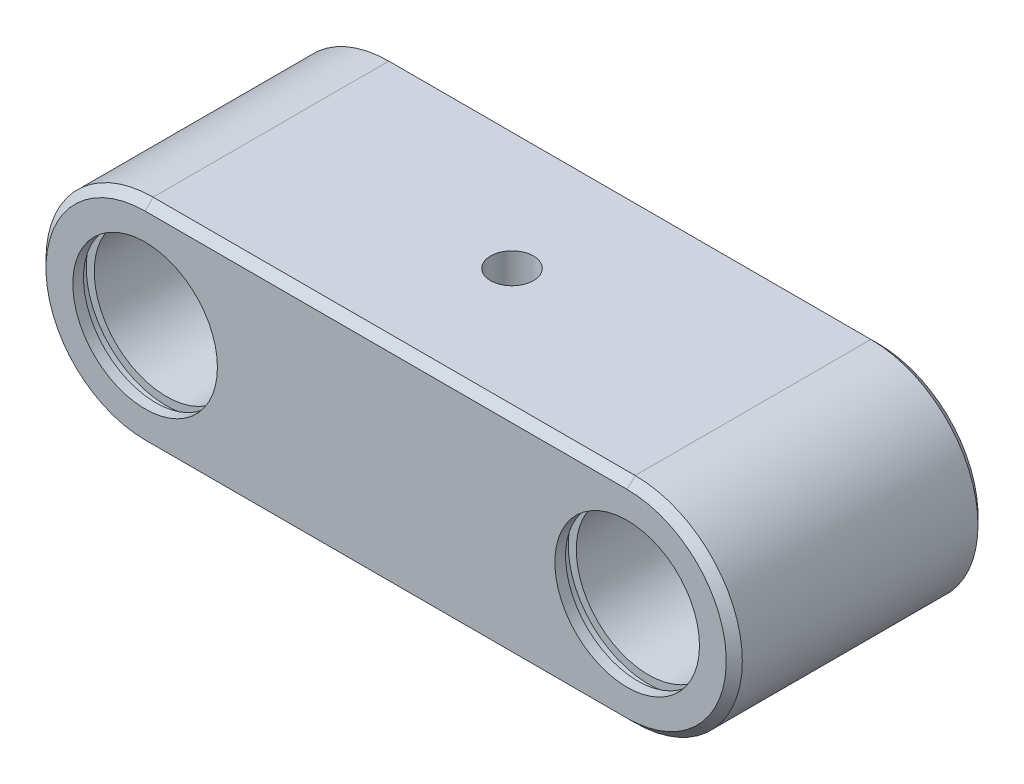
ISO-10303-21;
HEADER;
FILE_DESCRIPTION(('STEP AP214'),'2;1');
FILE_NAME('part.step','',(''),(''),'','','');
FILE_SCHEMA(('AUTOMOTIVE_DESIGN { 1 0 10303 214 1 1 1 1 }'));
ENDSEC;
DATA;
#1=APPLICATION_CONTEXT('core data for automotive mechanical design processes');
#2=APPLICATION_PROTOCOL_DEFINITION('international standard','automotive_design',2000,#1);
#3=PRODUCT_CONTEXT('',#1,'mechanical');
#4=PRODUCT('Part','Part','',(#3));
#5=PRODUCT_RELATED_PRODUCT_CATEGORY('part','',(#4));
#6=PRODUCT_DEFINITION_FORMATION('','',#4);
#7=PRODUCT_DEFINITION_CONTEXT('part definition',#1,'design');
#8=PRODUCT_DEFINITION('design','',#6,#7);
#9=PRODUCT_DEFINITION_SHAPE('','',#8);
#10=(LENGTH_UNIT() NAMED_UNIT(*) SI_UNIT(.MILLI.,.METRE.));
#11=(NAMED_UNIT(*) PLANE_ANGLE_UNIT() SI_UNIT($,.RADIAN.));
#12=(NAMED_UNIT(*) SI_UNIT($,.STERADIAN.) SOLID_ANGLE_UNIT());
#13=UNCERTAINTY_MEASURE_WITH_UNIT(LENGTH_MEASURE(1.E-05),#10,'distance_accuracy_value','');
#14=(GEOMETRIC_REPRESENTATION_CONTEXT(3) GLOBAL_UNCERTAINTY_ASSIGNED_CONTEXT((#13)) GLOBAL_UNIT_ASSIGNED_CONTEXT((#10,
#11,#12)) REPRESENTATION_CONTEXT('',''));
#15=CARTESIAN_POINT('',(0.,0.,0.));
#16=DIRECTION('',(0.,0.,1.));
#17=DIRECTION('',(1.,0.,0.));
#18=AXIS2_PLACEMENT_3D('',#15,#16,#17);
#19=CARTESIAN_POINT('',(-45.,0.,603.));
#20=DIRECTION('',(0.,0.,1.));
#21=DIRECTION('',(1.,0.,0.));
#22=AXIS2_PLACEMENT_3D('',#19,#20,#21);
#23=CYLINDRICAL_SURFACE('',#22,13.5);
#24=CARTESIAN_POINT('',(-45.,0.,646.));
#25=DIRECTION('',(0.,0.,1.));
#26=DIRECTION('',(1.,0.,0.));
#27=AXIS2_PLACEMENT_3D('',#24,#25,#26);
#28=CIRCLE('',#27,13.5);
#29=CARTESIAN_POINT('',(-31.5,0.,646.));
#30=VERTEX_POINT('',#29);
#31=EDGE_CURVE('E238',#30,#30,#28,.T.);
#32=ORIENTED_EDGE('',*,*,#31,.T.);
#33=EDGE_LOOP('',(#32));
#34=FACE_BOUND('',#33,.T.);
#35=CARTESIAN_POINT('',(-45.,0.,607.));
#36=DIRECTION('',(0.,0.,-1.));
#37=DIRECTION('',(-1.,0.,0.));
#38=AXIS2_PLACEMENT_3D('',#35,#36,#37);
#39=CIRCLE('',#38,13.5);
#40=CARTESIAN_POINT('',(-58.4999999999999,0.,607.));
#41=VERTEX_POINT('',#40);
#42=EDGE_CURVE('E255',#41,#41,#39,.T.);
#43=ORIENTED_EDGE('',*,*,#42,.T.);
#44=EDGE_LOOP('',(#43));
#45=FACE_BOUND('',#44,.T.);
#46=ADVANCED_FACE('F45',(#34,#45),#23,.F.);
#47=CARTESIAN_POINT('',(45.,0.,603.));
#48=DIRECTION('',(0.,0.,1.));
#49=DIRECTION('',(1.,0.,0.));
#50=AXIS2_PLACEMENT_3D('',#47,#48,#49);
#51=CYLINDRICAL_SURFACE('',#50,13.5);
#52=CARTESIAN_POINT('',(45.,0.,646.));
#53=DIRECTION('',(0.,0.,1.));
#54=DIRECTION('',(1.,0.,0.));
#55=AXIS2_PLACEMENT_3D('',#52,#53,#54);
#56=CIRCLE('',#55,13.5);
#57=CARTESIAN_POINT('',(58.5,0.,646.));
#58=VERTEX_POINT('',#57);
#59=EDGE_CURVE('E225',#58,#58,#56,.T.);
#60=ORIENTED_EDGE('',*,*,#59,.T.);
#61=EDGE_LOOP('',(#60));
#62=FACE_BOUND('',#61,.T.);
#63=CARTESIAN_POINT('',(45.,0.,607.));
#64=DIRECTION('',(0.,0.,-1.));
#65=DIRECTION('',(-1.,0.,0.));
#66=AXIS2_PLACEMENT_3D('',#63,#64,#65);
#67=CIRCLE('',#66,13.5);
#68=CARTESIAN_POINT('',(31.4999999999999,0.,607.));
#69=VERTEX_POINT('',#68);
#70=EDGE_CURVE('E266',#69,#69,#67,.T.);
#71=ORIENTED_EDGE('',*,*,#70,.T.);
#72=EDGE_LOOP('',(#71));
#73=FACE_BOUND('',#72,.T.);
#74=ADVANCED_FACE('F274',(#62,#73),#51,.F.);
#75=CARTESIAN_POINT('',(-45.,0.,605.));
#76=DIRECTION('',(0.,0.,-1.));
#77=DIRECTION('',(-1.,0.,0.));
#78=AXIS2_PLACEMENT_3D('',#75,#76,#77);
#79=CIRCLE('',#78,13.5);
#80=CARTESIAN_POINT('',(-58.4999999999999,0.,605.));
#81=VERTEX_POINT('',#80);
#82=EDGE_CURVE('E181',#81,#81,#79,.T.);
#83=ORIENTED_EDGE('',*,*,#82,.F.);
#84=EDGE_LOOP('',(#83));
#85=FACE_BOUND('',#84,.T.);
#86=CARTESIAN_POINT('',(-45.,0.,603.));
#87=DIRECTION('',(0.,0.,1.));
#88=DIRECTION('',(1.,0.,0.));
#89=AXIS2_PLACEMENT_3D('',#86,#87,#88);
#90=CIRCLE('',#89,13.5);
#91=CARTESIAN_POINT('',(-31.5,0.,603.));
#92=VERTEX_POINT('',#91);
#93=EDGE_CURVE('E139',#92,#92,#90,.T.);
#94=ORIENTED_EDGE('',*,*,#93,.F.);
#95=EDGE_LOOP('',(#94));
#96=FACE_BOUND('',#95,.T.);
#97=ADVANCED_FACE('F303',(#85,#96),#23,.F.);
#98=CARTESIAN_POINT('',(45.,0.,605.));
#99=DIRECTION('',(0.,0.,-1.));
#100=DIRECTION('',(-1.,0.,0.));
#101=AXIS2_PLACEMENT_3D('',#98,#99,#100);
#102=CIRCLE('',#101,13.5);
#103=CARTESIAN_POINT('',(31.4999999999999,0.,605.));
#104=VERTEX_POINT('',#103);
#105=EDGE_CURVE('E258',#104,#104,#102,.T.);
#106=ORIENTED_EDGE('',*,*,#105,.F.);
#107=EDGE_LOOP('',(#106));
#108=FACE_BOUND('',#107,.T.);
#109=CARTESIAN_POINT('',(45.,0.,603.));
#110=DIRECTION('',(0.,0.,1.));
#111=DIRECTION('',(1.,0.,0.));
#112=AXIS2_PLACEMENT_3D('',#109,#110,#111);
#113=CIRCLE('',#112,13.5);
#114=CARTESIAN_POINT('',(58.5,0.,603.));
#115=VERTEX_POINT('',#114);
#116=EDGE_CURVE('E212',#115,#115,#113,.T.);
#117=ORIENTED_EDGE('',*,*,#116,.F.);
#118=EDGE_LOOP('',(#117));
#119=FACE_BOUND('',#118,.T.);
#120=ADVANCED_FACE('F311',(#108,#119),#51,.F.);
#121=CARTESIAN_POINT('',(-45.,0.,603.));
#122=DIRECTION('',(0.,0.,1.));
#123=DIRECTION('',(1.,0.,0.));
#124=AXIS2_PLACEMENT_3D('',#121,#122,#123);
#125=CYLINDRICAL_SURFACE('',#124,20.);
#126=DIRECTION('',(0.,0.,1.));
#127=VECTOR('',#126,1.);
#128=CARTESIAN_POINT('',(-45.,20.,603.));
#129=LINE('',#128,#127);
#130=CARTESIAN_POINT('',(-45.,20.,604.5));
#131=VERTEX_POINT('',#130);
#132=CARTESIAN_POINT('',(-45.,20.,648.5));
#133=VERTEX_POINT('',#132);
#134=EDGE_CURVE('E121',#131,#133,#129,.T.);
#135=ORIENTED_EDGE('',*,*,#134,.F.);
#136=CARTESIAN_POINT('',(-45.,0.,604.5));
#137=DIRECTION('',(0.,0.,1.));
#138=DIRECTION('',(1.,0.,0.));
#139=AXIS2_PLACEMENT_3D('',#136,#137,#138);
#140=CIRCLE('',#139,20.);
#141=CARTESIAN_POINT('',(-45.,-20.,604.5));
#142=VERTEX_POINT('',#141);
#143=EDGE_CURVE('E116',#131,#142,#140,.T.);
#144=ORIENTED_EDGE('',*,*,#143,.T.);
#145=DIRECTION('',(0.,0.,1.));
#146=VECTOR('',#145,1.);
#147=CARTESIAN_POINT('',(-45.,-20.,603.));
#148=LINE('',#147,#146);
#149=CARTESIAN_POINT('',(-45.,-20.,648.5));
#150=VERTEX_POINT('',#149);
#151=EDGE_CURVE('E119',#142,#150,#148,.T.);
#152=ORIENTED_EDGE('',*,*,#151,.T.);
#153=CARTESIAN_POINT('',(-45.,0.,648.5));
#154=DIRECTION('',(0.,0.,1.));
#155=DIRECTION('',(1.,0.,0.));
#156=AXIS2_PLACEMENT_3D('',#153,#154,#155);
#157=CIRCLE('',#156,20.);
#158=EDGE_CURVE('E127',#150,#133,#157,.F.);
#159=ORIENTED_EDGE('',*,*,#158,.T.);
#160=EDGE_LOOP('',(#135,#144,#152,#159));
#161=FACE_BOUND('',#160,.T.);
#162=ADVANCED_FACE('F118',(#161),#125,.T.);
#163=CARTESIAN_POINT('',(-45.,20.,603.));
#164=DIRECTION('',(0.,1.,0.));
#165=DIRECTION('',(0.,0.,1.));
#166=AXIS2_PLACEMENT_3D('',#163,#164,#165);
#167=PLANE('',#166);
#168=CARTESIAN_POINT('',(0.,20.,626.5));
#169=DIRECTION('',(0.,1.,0.));
#170=DIRECTION('',(0.,0.,1.));
#171=AXIS2_PLACEMENT_3D('',#168,#169,#170);
#172=CIRCLE('',#171,4.);
#173=CARTESIAN_POINT('',(0.,20.,630.5));
#174=VERTEX_POINT('',#173);
#175=EDGE_CURVE('E245',#174,#174,#172,.T.);
#176=ORIENTED_EDGE('',*,*,#175,.F.);
#177=EDGE_LOOP('',(#176));
#178=FACE_BOUND('',#177,.T.);
#179=DIRECTION('',(0.,0.,1.));
#180=VECTOR('',#179,1.);
#181=CARTESIAN_POINT('',(45.,20.,603.));
#182=LINE('',#181,#180);
#183=CARTESIAN_POINT('',(45.,20.,604.5));
#184=VERTEX_POINT('',#183);
#185=CARTESIAN_POINT('',(45.,20.,648.5));
#186=VERTEX_POINT('',#185);
#187=EDGE_CURVE('E201',#184,#186,#182,.T.);
#188=ORIENTED_EDGE('',*,*,#187,.F.);
#189=DIRECTION('',(-1.,0.,0.));
#190=VECTOR('',#189,1.);
#191=CARTESIAN_POINT('',(-45.,20.,604.5));
#192=LINE('',#191,#190);
#193=EDGE_CURVE('E170',#184,#131,#192,.T.);
#194=ORIENTED_EDGE('',*,*,#193,.T.);
#195=ORIENTED_EDGE('',*,*,#134,.T.);
#196=DIRECTION('',(1.,0.,0.));
#197=VECTOR('',#196,1.);
#198=CARTESIAN_POINT('',(-45.,20.,648.5));
#199=LINE('',#198,#197);
#200=EDGE_CURVE('E126',#133,#186,#199,.T.);
#201=ORIENTED_EDGE('',*,*,#200,.T.);
#202=EDGE_LOOP('',(#188,#194,#195,#201));
#203=FACE_BOUND('',#202,.T.);
#204=ADVANCED_FACE('F200',(#178,#203),#167,.T.);
#205=CARTESIAN_POINT('',(45.,0.,603.));
#206=DIRECTION('',(0.,0.,1.));
#207=DIRECTION('',(1.,0.,0.));
#208=AXIS2_PLACEMENT_3D('',#205,#206,#207);
#209=CYLINDRICAL_SURFACE('',#208,20.);
#210=DIRECTION('',(0.,0.,1.));
#211=VECTOR('',#210,1.);
#212=CARTESIAN_POINT('',(45.,-20.,603.));
#213=LINE('',#212,#211);
#214=CARTESIAN_POINT('',(45.,-20.,604.5));
#215=VERTEX_POINT('',#214);
#216=CARTESIAN_POINT('',(45.,-20.,648.5));
#217=VERTEX_POINT('',#216);
#218=EDGE_CURVE('E138',#215,#217,#213,.T.);
#219=ORIENTED_EDGE('',*,*,#218,.F.);
#220=CARTESIAN_POINT('',(45.,0.,604.5));
#221=DIRECTION('',(0.,0.,1.));
#222=DIRECTION('',(1.,0.,0.));
#223=AXIS2_PLACEMENT_3D('',#220,#221,#222);
#224=CIRCLE('',#223,20.);
#225=EDGE_CURVE('E166',#215,#184,#224,.T.);
#226=ORIENTED_EDGE('',*,*,#225,.T.);
#227=ORIENTED_EDGE('',*,*,#187,.T.);
#228=CARTESIAN_POINT('',(45.,0.,648.5));
#229=DIRECTION('',(0.,0.,1.));
#230=DIRECTION('',(1.,0.,0.));
#231=AXIS2_PLACEMENT_3D('',#228,#229,#230);
#232=CIRCLE('',#231,20.);
#233=EDGE_CURVE('E164',#186,#217,#232,.F.);
#234=ORIENTED_EDGE('',*,*,#233,.T.);
#235=EDGE_LOOP('',(#219,#226,#227,#234));
#236=FACE_BOUND('',#235,.T.);
#237=ADVANCED_FACE('F204',(#236),#209,.T.);
#238=CARTESIAN_POINT('',(-45.,-20.,603.));
#239=DIRECTION('',(0.,-1.,0.));
#240=DIRECTION('',(0.,0.,-1.));
#241=AXIS2_PLACEMENT_3D('',#238,#239,#240);
#242=PLANE('',#241);
#243=CARTESIAN_POINT('',(0.,-20.,626.5));
#244=DIRECTION('',(0.,1.,0.));
#245=DIRECTION('',(0.,0.,1.));
#246=AXIS2_PLACEMENT_3D('',#243,#244,#245);
#247=CIRCLE('',#246,4.);
#248=CARTESIAN_POINT('',(0.,-20.,630.5));
#249=VERTEX_POINT('',#248);
#250=EDGE_CURVE('E232',#249,#249,#247,.T.);
#251=ORIENTED_EDGE('',*,*,#250,.T.);
#252=EDGE_LOOP('',(#251));
#253=FACE_BOUND('',#252,.T.);
#254=ORIENTED_EDGE('',*,*,#151,.F.);
#255=DIRECTION('',(1.,0.,0.));
#256=VECTOR('',#255,1.);
#257=CARTESIAN_POINT('',(45.,-20.,604.5));
#258=LINE('',#257,#256);
#259=EDGE_CURVE('E135',#142,#215,#258,.T.);
#260=ORIENTED_EDGE('',*,*,#259,.T.);
#261=ORIENTED_EDGE('',*,*,#218,.T.);
#262=DIRECTION('',(-1.,0.,0.));
#263=VECTOR('',#262,1.);
#264=CARTESIAN_POINT('',(-45.,-20.,648.5));
#265=LINE('',#264,#263);
#266=EDGE_CURVE('E137',#217,#150,#265,.T.);
#267=ORIENTED_EDGE('',*,*,#266,.T.);
#268=EDGE_LOOP('',(#254,#260,#261,#267));
#269=FACE_BOUND('',#268,.T.);
#270=ADVANCED_FACE('F132',(#253,#269),#242,.T.);
#271=CARTESIAN_POINT('',(-45.,0.,603.));
#272=DIRECTION('',(0.,0.,1.));
#273=DIRECTION('',(1.,0.,0.));
#274=AXIS2_PLACEMENT_3D('',#271,#272,#273);
#275=PLANE('',#274);
#276=CARTESIAN_POINT('',(45.,0.,603.));
#277=DIRECTION('',(0.,0.,1.));
#278=DIRECTION('',(1.,0.,0.));
#279=AXIS2_PLACEMENT_3D('',#276,#277,#278);
#280=CIRCLE('',#279,18.5);
#281=CARTESIAN_POINT('',(45.,18.5,603.));
#282=VERTEX_POINT('',#281);
#283=CARTESIAN_POINT('',(45.,-18.5,603.));
#284=VERTEX_POINT('',#283);
#285=EDGE_CURVE('E160',#282,#284,#280,.F.);
#286=ORIENTED_EDGE('',*,*,#285,.T.);
#287=DIRECTION('',(-1.,0.,0.));
#288=VECTOR('',#287,1.);
#289=CARTESIAN_POINT('',(-45.,-18.5,603.));
#290=LINE('',#289,#288);
#291=CARTESIAN_POINT('',(-45.,-18.5,603.));
#292=VERTEX_POINT('',#291);
#293=EDGE_CURVE('E162',#284,#292,#290,.T.);
#294=ORIENTED_EDGE('',*,*,#293,.T.);
#295=CARTESIAN_POINT('',(-45.,0.,603.));
#296=DIRECTION('',(0.,0.,1.));
#297=DIRECTION('',(1.,0.,0.));
#298=AXIS2_PLACEMENT_3D('',#295,#296,#297);
#299=CIRCLE('',#298,18.5);
#300=CARTESIAN_POINT('',(-45.,18.5,603.));
#301=VERTEX_POINT('',#300);
#302=EDGE_CURVE('E144',#292,#301,#299,.F.);
#303=ORIENTED_EDGE('',*,*,#302,.T.);
#304=DIRECTION('',(1.,0.,0.));
#305=VECTOR('',#304,1.);
#306=CARTESIAN_POINT('',(45.,18.5,603.));
#307=LINE('',#306,#305);
#308=EDGE_CURVE('E154',#301,#282,#307,.T.);
#309=ORIENTED_EDGE('',*,*,#308,.T.);
#310=EDGE_LOOP('',(#286,#294,#303,#309));
#311=FACE_BOUND('',#310,.T.);
#312=ORIENTED_EDGE('',*,*,#116,.T.);
#313=EDGE_LOOP('',(#312));
#314=FACE_BOUND('',#313,.T.);
#315=ORIENTED_EDGE('',*,*,#93,.T.);
#316=EDGE_LOOP('',(#315));
#317=FACE_BOUND('',#316,.T.);
#318=ADVANCED_FACE('F326',(#311,#314,#317),#275,.F.);
#319=CARTESIAN_POINT('',(-45.,0.,650.));
#320=DIRECTION('',(0.,0.,1.));
#321=DIRECTION('',(1.,0.,0.));
#322=AXIS2_PLACEMENT_3D('',#319,#320,#321);
#323=PLANE('',#322);
#324=CARTESIAN_POINT('',(-45.,0.,650.));
#325=DIRECTION('',(0.,0.,1.));
#326=DIRECTION('',(1.,0.,0.));
#327=AXIS2_PLACEMENT_3D('',#324,#325,#326);
#328=CIRCLE('',#327,18.5);
#329=CARTESIAN_POINT('',(-45.,18.5,650.));
#330=VERTEX_POINT('',#329);
#331=CARTESIAN_POINT('',(-45.,-18.5,650.));
#332=VERTEX_POINT('',#331);
#333=EDGE_CURVE('E70',#330,#332,#328,.T.);
#334=ORIENTED_EDGE('',*,*,#333,.T.);
#335=DIRECTION('',(1.,0.,0.));
#336=VECTOR('',#335,1.);
#337=CARTESIAN_POINT('',(-45.,-18.5,650.));
#338=LINE('',#337,#336);
#339=CARTESIAN_POINT('',(45.,-18.5,650.));
#340=VERTEX_POINT('',#339);
#341=EDGE_CURVE('E11',#332,#340,#338,.T.);
#342=ORIENTED_EDGE('',*,*,#341,.T.);
#343=CARTESIAN_POINT('',(45.,0.,650.));
#344=DIRECTION('',(0.,0.,1.));
#345=DIRECTION('',(1.,0.,0.));
#346=AXIS2_PLACEMENT_3D('',#343,#344,#345);
#347=CIRCLE('',#346,18.5);
#348=CARTESIAN_POINT('',(45.,18.5,650.));
#349=VERTEX_POINT('',#348);
#350=EDGE_CURVE('E55',#340,#349,#347,.T.);
#351=ORIENTED_EDGE('',*,*,#350,.T.);
#352=DIRECTION('',(-1.,0.,0.));
#353=VECTOR('',#352,1.);
#354=CARTESIAN_POINT('',(-45.,18.5,650.));
#355=LINE('',#354,#353);
#356=EDGE_CURVE('E172',#349,#330,#355,.T.);
#357=ORIENTED_EDGE('',*,*,#356,.T.);
#358=EDGE_LOOP('',(#334,#342,#351,#357));
#359=FACE_BOUND('',#358,.T.);
#360=CARTESIAN_POINT('',(45.,0.,650.));
#361=DIRECTION('',(0.,0.,1.));
#362=DIRECTION('',(1.,0.,0.));
#363=AXIS2_PLACEMENT_3D('',#360,#361,#362);
#364=CIRCLE('',#363,13.5);
#365=CARTESIAN_POINT('',(58.5,0.,650.));
#366=VERTEX_POINT('',#365);
#367=EDGE_CURVE('E215',#366,#366,#364,.T.);
#368=ORIENTED_EDGE('',*,*,#367,.F.);
#369=EDGE_LOOP('',(#368));
#370=FACE_BOUND('',#369,.T.);
#371=CARTESIAN_POINT('',(-45.,0.,650.));
#372=DIRECTION('',(0.,0.,1.));
#373=DIRECTION('',(1.,0.,0.));
#374=AXIS2_PLACEMENT_3D('',#371,#372,#373);
#375=CIRCLE('',#374,13.5);
#376=CARTESIAN_POINT('',(-31.5,0.,650.));
#377=VERTEX_POINT('',#376);
#378=EDGE_CURVE('E209',#377,#377,#375,.T.);
#379=ORIENTED_EDGE('',*,*,#378,.F.);
#380=EDGE_LOOP('',(#379));
#381=FACE_BOUND('',#380,.T.);
#382=ADVANCED_FACE('F318',(#359,#370,#381),#323,.T.);
#383=CARTESIAN_POINT('',(-45.,0.,648.));
#384=DIRECTION('',(0.,0.,1.));
#385=DIRECTION('',(1.,0.,0.));
#386=AXIS2_PLACEMENT_3D('',#383,#384,#385);
#387=CIRCLE('',#386,13.5);
#388=CARTESIAN_POINT('',(-31.5,0.,648.));
#389=VERTEX_POINT('',#388);
#390=EDGE_CURVE('E228',#389,#389,#387,.T.);
#391=ORIENTED_EDGE('',*,*,#390,.F.);
#392=EDGE_LOOP('',(#391));
#393=FACE_BOUND('',#392,.T.);
#394=ORIENTED_EDGE('',*,*,#378,.T.);
#395=EDGE_LOOP('',(#394));
#396=FACE_BOUND('',#395,.T.);
#397=ADVANCED_FACE('F304',(#393,#396),#23,.F.);
#398=CARTESIAN_POINT('',(45.,0.,648.));
#399=DIRECTION('',(0.,0.,1.));
#400=DIRECTION('',(1.,0.,0.));
#401=AXIS2_PLACEMENT_3D('',#398,#399,#400);
#402=CIRCLE('',#401,13.5);
#403=CARTESIAN_POINT('',(58.5,0.,648.));
#404=VERTEX_POINT('',#403);
#405=EDGE_CURVE('E229',#404,#404,#402,.T.);
#406=ORIENTED_EDGE('',*,*,#405,.F.);
#407=EDGE_LOOP('',(#406));
#408=FACE_BOUND('',#407,.T.);
#409=ORIENTED_EDGE('',*,*,#367,.T.);
#410=EDGE_LOOP('',(#409));
#411=FACE_BOUND('',#410,.T.);
#412=ADVANCED_FACE('F312',(#408,#411),#51,.F.);
#413=CARTESIAN_POINT('',(45.,0.,646.));
#414=DIRECTION('',(0.,0.,1.));
#415=DIRECTION('',(1.,0.,0.));
#416=AXIS2_PLACEMENT_3D('',#413,#414,#415);
#417=CYLINDRICAL_SURFACE('',#416,15.);
#418=CARTESIAN_POINT('',(45.,0.,646.));
#419=DIRECTION('',(0.,0.,1.));
#420=DIRECTION('',(1.,0.,0.));
#421=AXIS2_PLACEMENT_3D('',#418,#419,#420);
#422=CIRCLE('',#421,15.);
#423=CARTESIAN_POINT('',(60.,0.,646.));
#424=VERTEX_POINT('',#423);
#425=EDGE_CURVE('E224',#424,#424,#422,.T.);
#426=ORIENTED_EDGE('',*,*,#425,.F.);
#427=EDGE_LOOP('',(#426));
#428=FACE_BOUND('',#427,.T.);
#429=CARTESIAN_POINT('',(45.,0.,648.));
#430=DIRECTION('',(0.,0.,1.));
#431=DIRECTION('',(1.,0.,0.));
#432=AXIS2_PLACEMENT_3D('',#429,#430,#431);
#433=CIRCLE('',#432,15.);
#434=CARTESIAN_POINT('',(60.,0.,648.));
#435=VERTEX_POINT('',#434);
#436=EDGE_CURVE('E221',#435,#435,#433,.T.);
#437=ORIENTED_EDGE('',*,*,#436,.T.);
#438=EDGE_LOOP('',(#437));
#439=FACE_BOUND('',#438,.T.);
#440=ADVANCED_FACE('F323',(#428,#439),#417,.F.);
#441=CARTESIAN_POINT('',(45.,0.,646.));
#442=DIRECTION('',(0.,0.,1.));
#443=DIRECTION('',(1.,0.,0.));
#444=AXIS2_PLACEMENT_3D('',#441,#442,#443);
#445=PLANE('',#444);
#446=ORIENTED_EDGE('',*,*,#59,.F.);
#447=EDGE_LOOP('',(#446));
#448=FACE_BOUND('',#447,.T.);
#449=ORIENTED_EDGE('',*,*,#425,.T.);
#450=EDGE_LOOP('',(#449));
#451=FACE_BOUND('',#450,.T.);
#452=ADVANCED_FACE('F351',(#448,#451),#445,.T.);
#453=CARTESIAN_POINT('',(45.,0.,648.));
#454=DIRECTION('',(0.,0.,1.));
#455=DIRECTION('',(1.,0.,0.));
#456=AXIS2_PLACEMENT_3D('',#453,#454,#455);
#457=PLANE('',#456);
#458=ORIENTED_EDGE('',*,*,#405,.T.);
#459=EDGE_LOOP('',(#458));
#460=FACE_BOUND('',#459,.T.);
#461=ORIENTED_EDGE('',*,*,#436,.F.);
#462=EDGE_LOOP('',(#461));
#463=FACE_BOUND('',#462,.T.);
#464=ADVANCED_FACE('F342',(#460,#463),#457,.F.);
#465=CARTESIAN_POINT('',(-45.,0.,646.));
#466=DIRECTION('',(0.,0.,1.));
#467=DIRECTION('',(1.,0.,0.));
#468=AXIS2_PLACEMENT_3D('',#465,#466,#467);
#469=CYLINDRICAL_SURFACE('',#468,15.);
#470=CARTESIAN_POINT('',(-45.,0.,646.));
#471=DIRECTION('',(0.,0.,1.));
#472=DIRECTION('',(1.,0.,0.));
#473=AXIS2_PLACEMENT_3D('',#470,#471,#472);
#474=CIRCLE('',#473,15.);
#475=CARTESIAN_POINT('',(-30.,0.,646.));
#476=VERTEX_POINT('',#475);
#477=EDGE_CURVE('E218',#476,#476,#474,.T.);
#478=ORIENTED_EDGE('',*,*,#477,.F.);
#479=EDGE_LOOP('',(#478));
#480=FACE_BOUND('',#479,.T.);
#481=CARTESIAN_POINT('',(-45.,0.,648.));
#482=DIRECTION('',(0.,0.,1.));
#483=DIRECTION('',(1.,0.,0.));
#484=AXIS2_PLACEMENT_3D('',#481,#482,#483);
#485=CIRCLE('',#484,15.);
#486=CARTESIAN_POINT('',(-30.,0.,648.));
#487=VERTEX_POINT('',#486);
#488=EDGE_CURVE('E235',#487,#487,#485,.T.);
#489=ORIENTED_EDGE('',*,*,#488,.T.);
#490=EDGE_LOOP('',(#489));
#491=FACE_BOUND('',#490,.T.);
#492=ADVANCED_FACE('F340',(#480,#491),#469,.F.);
#493=CARTESIAN_POINT('',(-45.,0.,646.));
#494=DIRECTION('',(0.,0.,1.));
#495=DIRECTION('',(1.,0.,0.));
#496=AXIS2_PLACEMENT_3D('',#493,#494,#495);
#497=PLANE('',#496);
#498=ORIENTED_EDGE('',*,*,#31,.F.);
#499=EDGE_LOOP('',(#498));
#500=FACE_BOUND('',#499,.T.);
#501=ORIENTED_EDGE('',*,*,#477,.T.);
#502=EDGE_LOOP('',(#501));
#503=FACE_BOUND('',#502,.T.);
#504=ADVANCED_FACE('F336',(#500,#503),#497,.T.);
#505=CARTESIAN_POINT('',(-45.,0.,648.));
#506=DIRECTION('',(0.,0.,1.));
#507=DIRECTION('',(1.,0.,0.));
#508=AXIS2_PLACEMENT_3D('',#505,#506,#507);
#509=PLANE('',#508);
#510=ORIENTED_EDGE('',*,*,#390,.T.);
#511=EDGE_LOOP('',(#510));
#512=FACE_BOUND('',#511,.T.);
#513=ORIENTED_EDGE('',*,*,#488,.F.);
#514=EDGE_LOOP('',(#513));
#515=FACE_BOUND('',#514,.T.);
#516=ADVANCED_FACE('F333',(#512,#515),#509,.F.);
#517=CARTESIAN_POINT('',(0.,-20.,626.5));
#518=DIRECTION('',(0.,1.,0.));
#519=DIRECTION('',(0.,0.,1.));
#520=AXIS2_PLACEMENT_3D('',#517,#518,#519);
#521=CYLINDRICAL_SURFACE('',#520,4.);
#522=ORIENTED_EDGE('',*,*,#250,.F.);
#523=EDGE_LOOP('',(#522));
#524=FACE_BOUND('',#523,.T.);
#525=ORIENTED_EDGE('',*,*,#175,.T.);
#526=EDGE_LOOP('',(#525));
#527=FACE_BOUND('',#526,.T.);
#528=ADVANCED_FACE('F286',(#524,#527),#521,.F.);
#529=CARTESIAN_POINT('',(45.,0.,607.));
#530=DIRECTION('',(0.,0.,-1.));
#531=DIRECTION('',(-1.,0.,0.));
#532=AXIS2_PLACEMENT_3D('',#529,#530,#531);
#533=CYLINDRICAL_SURFACE('',#532,15.);
#534=CARTESIAN_POINT('',(45.,0.,607.));
#535=DIRECTION('',(0.,0.,-1.));
#536=DIRECTION('',(-1.,0.,0.));
#537=AXIS2_PLACEMENT_3D('',#534,#535,#536);
#538=CIRCLE('',#537,15.);
#539=CARTESIAN_POINT('',(30.,0.,607.));
#540=VERTEX_POINT('',#539);
#541=EDGE_CURVE('E248',#540,#540,#538,.T.);
#542=ORIENTED_EDGE('',*,*,#541,.F.);
#543=EDGE_LOOP('',(#542));
#544=FACE_BOUND('',#543,.T.);
#545=CARTESIAN_POINT('',(45.,0.,605.));
#546=DIRECTION('',(0.,0.,-1.));
#547=DIRECTION('',(-1.,0.,0.));
#548=AXIS2_PLACEMENT_3D('',#545,#546,#547);
#549=CIRCLE('',#548,15.);
#550=CARTESIAN_POINT('',(30.,0.,605.));
#551=VERTEX_POINT('',#550);
#552=EDGE_CURVE('E263',#551,#551,#549,.T.);
#553=ORIENTED_EDGE('',*,*,#552,.T.);
#554=EDGE_LOOP('',(#553));
#555=FACE_BOUND('',#554,.T.);
#556=ADVANCED_FACE('F280',(#544,#555),#533,.F.);
#557=CARTESIAN_POINT('',(45.,0.,607.));
#558=DIRECTION('',(0.,0.,-1.));
#559=DIRECTION('',(-1.,0.,0.));
#560=AXIS2_PLACEMENT_3D('',#557,#558,#559);
#561=PLANE('',#560);
#562=ORIENTED_EDGE('',*,*,#70,.F.);
#563=EDGE_LOOP('',(#562));
#564=FACE_BOUND('',#563,.T.);
#565=ORIENTED_EDGE('',*,*,#541,.T.);
#566=EDGE_LOOP('',(#565));
#567=FACE_BOUND('',#566,.T.);
#568=ADVANCED_FACE('F276',(#564,#567),#561,.T.);
#569=CARTESIAN_POINT('',(45.,0.,605.));
#570=DIRECTION('',(0.,0.,-1.));
#571=DIRECTION('',(-1.,0.,0.));
#572=AXIS2_PLACEMENT_3D('',#569,#570,#571);
#573=PLANE('',#572);
#574=ORIENTED_EDGE('',*,*,#105,.T.);
#575=EDGE_LOOP('',(#574));
#576=FACE_BOUND('',#575,.T.);
#577=ORIENTED_EDGE('',*,*,#552,.F.);
#578=EDGE_LOOP('',(#577));
#579=FACE_BOUND('',#578,.T.);
#580=ADVANCED_FACE('F279',(#576,#579),#573,.F.);
#581=CARTESIAN_POINT('',(-45.,0.,607.));
#582=DIRECTION('',(0.,0.,-1.));
#583=DIRECTION('',(-1.,0.,0.));
#584=AXIS2_PLACEMENT_3D('',#581,#582,#583);
#585=CYLINDRICAL_SURFACE('',#584,15.);
#586=CARTESIAN_POINT('',(-45.,0.,607.));
#587=DIRECTION('',(0.,0.,-1.));
#588=DIRECTION('',(-1.,0.,0.));
#589=AXIS2_PLACEMENT_3D('',#586,#587,#588);
#590=CIRCLE('',#589,15.);
#591=CARTESIAN_POINT('',(-60.,0.,607.));
#592=VERTEX_POINT('',#591);
#593=EDGE_CURVE('E254',#592,#592,#590,.T.);
#594=ORIENTED_EDGE('',*,*,#593,.F.);
#595=EDGE_LOOP('',(#594));
#596=FACE_BOUND('',#595,.T.);
#597=CARTESIAN_POINT('',(-45.,0.,605.));
#598=DIRECTION('',(0.,0.,-1.));
#599=DIRECTION('',(-1.,0.,0.));
#600=AXIS2_PLACEMENT_3D('',#597,#598,#599);
#601=CIRCLE('',#600,15.);
#602=CARTESIAN_POINT('',(-60.,0.,605.));
#603=VERTEX_POINT('',#602);
#604=EDGE_CURVE('E251',#603,#603,#601,.T.);
#605=ORIENTED_EDGE('',*,*,#604,.T.);
#606=EDGE_LOOP('',(#605));
#607=FACE_BOUND('',#606,.T.);
#608=ADVANCED_FACE('F291',(#596,#607),#585,.F.);
#609=CARTESIAN_POINT('',(-45.,0.,607.));
#610=DIRECTION('',(0.,0.,-1.));
#611=DIRECTION('',(-1.,0.,0.));
#612=AXIS2_PLACEMENT_3D('',#609,#610,#611);
#613=PLANE('',#612);
#614=ORIENTED_EDGE('',*,*,#42,.F.);
#615=EDGE_LOOP('',(#614));
#616=FACE_BOUND('',#615,.T.);
#617=ORIENTED_EDGE('',*,*,#593,.T.);
#618=EDGE_LOOP('',(#617));
#619=FACE_BOUND('',#618,.T.);
#620=ADVANCED_FACE('F297',(#616,#619),#613,.T.);
#621=CARTESIAN_POINT('',(-45.,0.,605.));
#622=DIRECTION('',(0.,0.,-1.));
#623=DIRECTION('',(-1.,0.,0.));
#624=AXIS2_PLACEMENT_3D('',#621,#622,#623);
#625=PLANE('',#624);
#626=ORIENTED_EDGE('',*,*,#82,.T.);
#627=EDGE_LOOP('',(#626));
#628=FACE_BOUND('',#627,.T.);
#629=ORIENTED_EDGE('',*,*,#604,.F.);
#630=EDGE_LOOP('',(#629));
#631=FACE_BOUND('',#630,.T.);
#632=ADVANCED_FACE('F423',(#628,#631),#625,.F.);
#633=CARTESIAN_POINT('',(-45.,20.,604.5));
#634=DIRECTION('',(0.,0.707106781186544,-0.707106781186551));
#635=DIRECTION('',(1.,0.,0.));
#636=AXIS2_PLACEMENT_3D('',#633,#634,#635);
#637=PLANE('',#636);
#638=DIRECTION('',(0.,0.707106781186551,0.707106781186544));
#639=VECTOR('',#638,1.);
#640=CARTESIAN_POINT('',(45.,18.5,603.));
#641=LINE('',#640,#639);
#642=EDGE_CURVE('E148',#282,#184,#641,.T.);
#643=ORIENTED_EDGE('',*,*,#642,.F.);
#644=ORIENTED_EDGE('',*,*,#308,.F.);
#645=DIRECTION('',(0.,-0.707106781186551,-0.707106781186544));
#646=VECTOR('',#645,1.);
#647=CARTESIAN_POINT('',(-45.,20.,604.5));
#648=LINE('',#647,#646);
#649=EDGE_CURVE('E179',#131,#301,#648,.T.);
#650=ORIENTED_EDGE('',*,*,#649,.F.);
#651=ORIENTED_EDGE('',*,*,#193,.F.);
#652=EDGE_LOOP('',(#643,#644,#650,#651));
#653=FACE_BOUND('',#652,.T.);
#654=ADVANCED_FACE('F431',(#653),#637,.T.);
#655=CARTESIAN_POINT('',(-45.,0.,604.5));
#656=DIRECTION('',(0.,0.,1.));
#657=DIRECTION('',(1.,0.,0.));
#658=AXIS2_PLACEMENT_3D('',#655,#656,#657);
#659=CONICAL_SURFACE('',#658,20.,0.785398163397453);
#660=ORIENTED_EDGE('',*,*,#649,.T.);
#661=ORIENTED_EDGE('',*,*,#302,.F.);
#662=DIRECTION('',(0.,0.707106781186551,-0.707106781186544));
#663=VECTOR('',#662,1.);
#664=CARTESIAN_POINT('',(-45.,-20.,604.5));
#665=LINE('',#664,#663);
#666=EDGE_CURVE('E142',#142,#292,#665,.T.);
#667=ORIENTED_EDGE('',*,*,#666,.F.);
#668=ORIENTED_EDGE('',*,*,#143,.F.);
#669=EDGE_LOOP('',(#660,#661,#667,#668));
#670=FACE_BOUND('',#669,.T.);
#671=ADVANCED_FACE('F143',(#670),#659,.T.);
#672=CARTESIAN_POINT('',(45.,0.,604.5));
#673=DIRECTION('',(0.,0.,1.));
#674=DIRECTION('',(1.,0.,0.));
#675=AXIS2_PLACEMENT_3D('',#672,#673,#674);
#676=CONICAL_SURFACE('',#675,20.,0.785398163397453);
#677=ORIENTED_EDGE('',*,*,#642,.T.);
#678=ORIENTED_EDGE('',*,*,#225,.F.);
#679=DIRECTION('',(0.,-0.707106781186551,0.707106781186544));
#680=VECTOR('',#679,1.);
#681=CARTESIAN_POINT('',(45.,-18.5,603.));
#682=LINE('',#681,#680);
#683=EDGE_CURVE('E149',#284,#215,#682,.T.);
#684=ORIENTED_EDGE('',*,*,#683,.F.);
#685=ORIENTED_EDGE('',*,*,#285,.F.);
#686=EDGE_LOOP('',(#677,#678,#684,#685));
#687=FACE_BOUND('',#686,.T.);
#688=ADVANCED_FACE('F447',(#687),#676,.T.);
#689=CARTESIAN_POINT('',(-45.,-20.,604.5));
#690=DIRECTION('',(0.,-0.707106781186544,-0.707106781186551));
#691=DIRECTION('',(-1.,0.,0.));
#692=AXIS2_PLACEMENT_3D('',#689,#690,#691);
#693=PLANE('',#692);
#694=ORIENTED_EDGE('',*,*,#666,.T.);
#695=ORIENTED_EDGE('',*,*,#293,.F.);
#696=ORIENTED_EDGE('',*,*,#683,.T.);
#697=ORIENTED_EDGE('',*,*,#259,.F.);
#698=EDGE_LOOP('',(#694,#695,#696,#697));
#699=FACE_BOUND('',#698,.T.);
#700=ADVANCED_FACE('F151',(#699),#693,.T.);
#701=CARTESIAN_POINT('',(-45.,18.5,650.));
#702=DIRECTION('',(0.,-0.707106781186538,-0.707106781186557));
#703=DIRECTION('',(-1.,0.,0.));
#704=AXIS2_PLACEMENT_3D('',#701,#702,#703);
#705=PLANE('',#704);
#706=DIRECTION('',(0.,-0.707106781186557,0.707106781186538));
#707=VECTOR('',#706,1.);
#708=CARTESIAN_POINT('',(45.,20.,648.5));
#709=LINE('',#708,#707);
#710=EDGE_CURVE('E184',#186,#349,#709,.T.);
#711=ORIENTED_EDGE('',*,*,#710,.F.);
#712=ORIENTED_EDGE('',*,*,#200,.F.);
#713=DIRECTION('',(0.,0.707106781186557,-0.707106781186538));
#714=VECTOR('',#713,1.);
#715=CARTESIAN_POINT('',(-45.,18.5,650.));
#716=LINE('',#715,#714);
#717=EDGE_CURVE('E50',#330,#133,#716,.T.);
#718=ORIENTED_EDGE('',*,*,#717,.F.);
#719=ORIENTED_EDGE('',*,*,#356,.F.);
#720=EDGE_LOOP('',(#711,#712,#718,#719));
#721=FACE_BOUND('',#720,.T.);
#722=ADVANCED_FACE('F48',(#721),#705,.F.);
#723=CARTESIAN_POINT('',(-45.,0.,650.));
#724=DIRECTION('',(0.,0.,-1.));
#725=DIRECTION('',(-1.,0.,0.));
#726=AXIS2_PLACEMENT_3D('',#723,#724,#725);
#727=CONICAL_SURFACE('',#726,18.5,0.785398163397462);
#728=ORIENTED_EDGE('',*,*,#717,.T.);
#729=ORIENTED_EDGE('',*,*,#158,.F.);
#730=DIRECTION('',(0.,-0.707106781186557,-0.707106781186538));
#731=VECTOR('',#730,1.);
#732=CARTESIAN_POINT('',(-45.,-18.5,650.));
#733=LINE('',#732,#731);
#734=EDGE_CURVE('E183',#332,#150,#733,.T.);
#735=ORIENTED_EDGE('',*,*,#734,.F.);
#736=ORIENTED_EDGE('',*,*,#333,.F.);
#737=EDGE_LOOP('',(#728,#729,#735,#736));
#738=FACE_BOUND('',#737,.T.);
#739=ADVANCED_FACE('F193',(#738),#727,.T.);
#740=CARTESIAN_POINT('',(45.,0.,650.));
#741=DIRECTION('',(0.,0.,-1.));
#742=DIRECTION('',(-1.,0.,0.));
#743=AXIS2_PLACEMENT_3D('',#740,#741,#742);
#744=CONICAL_SURFACE('',#743,18.5,0.785398163397462);
#745=ORIENTED_EDGE('',*,*,#710,.T.);
#746=ORIENTED_EDGE('',*,*,#350,.F.);
#747=DIRECTION('',(0.,0.707106781186557,0.707106781186538));
#748=VECTOR('',#747,1.);
#749=CARTESIAN_POINT('',(45.,-20.,648.5));
#750=LINE('',#749,#748);
#751=EDGE_CURVE('E63',#217,#340,#750,.T.);
#752=ORIENTED_EDGE('',*,*,#751,.F.);
#753=ORIENTED_EDGE('',*,*,#233,.F.);
#754=EDGE_LOOP('',(#745,#746,#752,#753));
#755=FACE_BOUND('',#754,.T.);
#756=ADVANCED_FACE('F472',(#755),#744,.T.);
#757=CARTESIAN_POINT('',(-45.,-18.5,650.));
#758=DIRECTION('',(0.,0.707106781186538,-0.707106781186557));
#759=DIRECTION('',(1.,0.,0.));
#760=AXIS2_PLACEMENT_3D('',#757,#758,#759);
#761=PLANE('',#760);
#762=ORIENTED_EDGE('',*,*,#734,.T.);
#763=ORIENTED_EDGE('',*,*,#266,.F.);
#764=ORIENTED_EDGE('',*,*,#751,.T.);
#765=ORIENTED_EDGE('',*,*,#341,.F.);
#766=EDGE_LOOP('',(#762,#763,#764,#765));
#767=FACE_BOUND('',#766,.T.);
#768=ADVANCED_FACE('F478',(#767),#761,.F.);
#769=CLOSED_SHELL('',(#46,#74,#97,#120,#162,#204,#237,#270,#318,#382,#397,#412,#440,#452,#464,
#492,#504,#516,#528,#556,#568,#580,#608,#620,#632,#654,#671,#688,#700,#722,#739,#756,#768));
#770=MANIFOLD_SOLID_BREP('B2',#769);
#771=ADVANCED_BREP_SHAPE_REPRESENTATION('',(#18,#770),#14);
#772=SHAPE_DEFINITION_REPRESENTATION(#9,#771);
ENDSEC;
END-ISO-10303-21;
